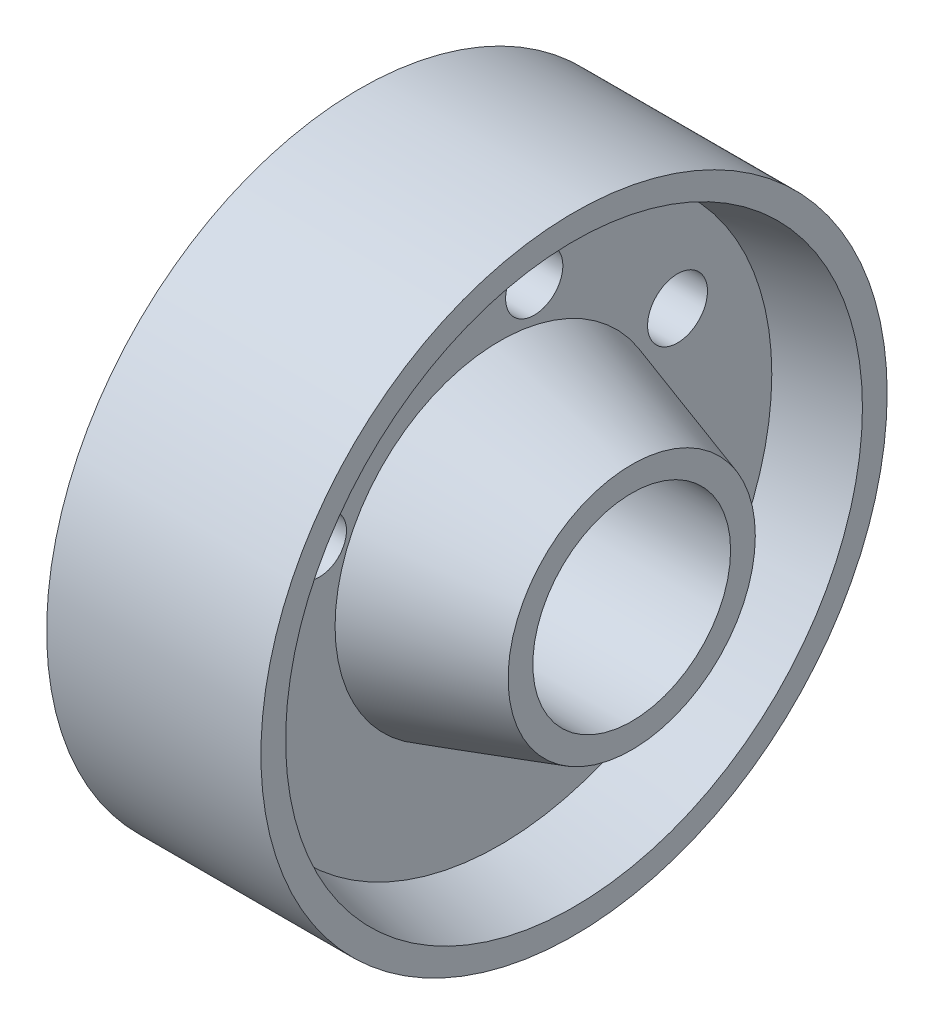
ISO-10303-21;
HEADER;
FILE_DESCRIPTION(('STEP AP214'),'2;1');
FILE_NAME('part.step','',(''),(''),'','','');
FILE_SCHEMA(('AUTOMOTIVE_DESIGN { 1 0 10303 214 1 1 1 1 }'));
ENDSEC;
DATA;
#1=APPLICATION_CONTEXT('core data for automotive mechanical design processes');
#2=APPLICATION_PROTOCOL_DEFINITION('international standard','automotive_design',2000,#1);
#3=PRODUCT_CONTEXT('',#1,'mechanical');
#4=PRODUCT('Part','Part','',(#3));
#5=PRODUCT_RELATED_PRODUCT_CATEGORY('part','',(#4));
#6=PRODUCT_DEFINITION_FORMATION('','',#4);
#7=PRODUCT_DEFINITION_CONTEXT('part definition',#1,'design');
#8=PRODUCT_DEFINITION('design','',#6,#7);
#9=PRODUCT_DEFINITION_SHAPE('','',#8);
#10=(LENGTH_UNIT() NAMED_UNIT(*) SI_UNIT(.MILLI.,.METRE.));
#11=(NAMED_UNIT(*) PLANE_ANGLE_UNIT() SI_UNIT($,.RADIAN.));
#12=(NAMED_UNIT(*) SI_UNIT($,.STERADIAN.) SOLID_ANGLE_UNIT());
#13=UNCERTAINTY_MEASURE_WITH_UNIT(LENGTH_MEASURE(1.E-05),#10,'distance_accuracy_value','');
#14=(GEOMETRIC_REPRESENTATION_CONTEXT(3) GLOBAL_UNCERTAINTY_ASSIGNED_CONTEXT((#13)) GLOBAL_UNIT_ASSIGNED_CONTEXT((#10,
#11,#12)) REPRESENTATION_CONTEXT('',''));
#15=CARTESIAN_POINT('',(0.,0.,0.));
#16=DIRECTION('',(0.,0.,1.));
#17=DIRECTION('',(1.,0.,0.));
#18=AXIS2_PLACEMENT_3D('',#15,#16,#17);
#19=CARTESIAN_POINT('',(29.5364069872464,0.,0.));
#20=DIRECTION('',(1.,0.,0.));
#21=DIRECTION('',(0.,0.,-1.));
#22=AXIS2_PLACEMENT_3D('',#19,#20,#21);
#23=CYLINDRICAL_SURFACE('',#22,12.);
#24=CARTESIAN_POINT('',(20.,0.,0.));
#25=DIRECTION('',(1.,0.,0.));
#26=DIRECTION('',(0.,0.,-1.));
#27=AXIS2_PLACEMENT_3D('',#24,#25,#26);
#28=CIRCLE('',#27,12.);
#29=CARTESIAN_POINT('',(20.,0.,-12.));
#30=VERTEX_POINT('',#29);
#31=EDGE_CURVE('E10',#30,#30,#28,.T.);
#32=ORIENTED_EDGE('',*,*,#31,.T.);
#33=EDGE_LOOP('',(#32));
#34=FACE_BOUND('',#33,.T.);
#35=CARTESIAN_POINT('',(-20.,0.,0.));
#36=DIRECTION('',(1.,0.,0.));
#37=DIRECTION('',(0.,0.,-1.));
#38=AXIS2_PLACEMENT_3D('',#35,#36,#37);
#39=CIRCLE('',#38,12.);
#40=CARTESIAN_POINT('',(-20.,0.,-12.));
#41=VERTEX_POINT('',#40);
#42=EDGE_CURVE('E71',#41,#41,#39,.T.);
#43=ORIENTED_EDGE('',*,*,#42,.F.);
#44=EDGE_LOOP('',(#43));
#45=FACE_BOUND('',#44,.T.);
#46=ADVANCED_FACE('F37',(#34,#45),#23,.F.);
#47=CARTESIAN_POINT('',(20.,12.,0.));
#48=DIRECTION('',(1.,0.,0.));
#49=DIRECTION('',(0.,0.,-1.));
#50=AXIS2_PLACEMENT_3D('',#47,#48,#49);
#51=PLANE('',#50);
#52=CARTESIAN_POINT('',(20.,0.,0.));
#53=DIRECTION('',(1.,0.,0.));
#54=DIRECTION('',(0.,0.,-1.));
#55=AXIS2_PLACEMENT_3D('',#52,#53,#54);
#56=CIRCLE('',#55,15.);
#57=CARTESIAN_POINT('',(20.,0.,-15.));
#58=VERTEX_POINT('',#57);
#59=EDGE_CURVE('E44',#58,#58,#56,.T.);
#60=ORIENTED_EDGE('',*,*,#59,.T.);
#61=EDGE_LOOP('',(#60));
#62=FACE_BOUND('',#61,.T.);
#63=ORIENTED_EDGE('',*,*,#31,.F.);
#64=EDGE_LOOP('',(#63));
#65=FACE_BOUND('',#64,.T.);
#66=ADVANCED_FACE('F118',(#62,#65),#51,.T.);
#67=CARTESIAN_POINT('',(20.,0.,0.));
#68=DIRECTION('',(-1.,0.,0.));
#69=DIRECTION('',(0.,0.,1.));
#70=AXIS2_PLACEMENT_3D('',#67,#68,#69);
#71=CONICAL_SURFACE('',#70,15.,0.302884868374971);
#72=CARTESIAN_POINT('',(4.,0.,0.));
#73=DIRECTION('',(1.,0.,0.));
#74=DIRECTION('',(0.,0.,-1.));
#75=AXIS2_PLACEMENT_3D('',#72,#73,#74);
#76=CIRCLE('',#75,20.);
#77=CARTESIAN_POINT('',(4.,0.,-20.));
#78=VERTEX_POINT('',#77);
#79=EDGE_CURVE('E49',#78,#78,#76,.T.);
#80=ORIENTED_EDGE('',*,*,#79,.T.);
#81=EDGE_LOOP('',(#80));
#82=FACE_BOUND('',#81,.T.);
#83=ORIENTED_EDGE('',*,*,#59,.F.);
#84=EDGE_LOOP('',(#83));
#85=FACE_BOUND('',#84,.T.);
#86=ADVANCED_FACE('F101',(#82,#85),#71,.T.);
#87=CARTESIAN_POINT('',(4.,20.,0.));
#88=DIRECTION('',(1.,0.,0.));
#89=DIRECTION('',(0.,0.,-1.));
#90=AXIS2_PLACEMENT_3D('',#87,#88,#89);
#91=PLANE('',#90);
#92=CARTESIAN_POINT('',(4.,9.38157811057917,21.8680251819841));
#93=DIRECTION('',(1.,0.,0.));
#94=DIRECTION('',(0.,0.,-1.));
#95=AXIS2_PLACEMENT_3D('',#92,#93,#94);
#96=CIRCLE('',#95,3.25324235110329);
#97=CARTESIAN_POINT('',(4.,9.38157811057917,18.6147828308808));
#98=VERTEX_POINT('',#97);
#99=EDGE_CURVE('E68',#98,#98,#96,.T.);
#100=ORIENTED_EDGE('',*,*,#99,.F.);
#101=EDGE_LOOP('',(#100));
#102=FACE_BOUND('',#101,.T.);
#103=CARTESIAN_POINT('',(4.,24.0897211875402,-4.16925207496423));
#104=DIRECTION('',(1.,0.,0.));
#105=DIRECTION('',(0.,0.,-1.));
#106=AXIS2_PLACEMENT_3D('',#103,#104,#105);
#107=CIRCLE('',#106,3.47588009217223);
#108=CARTESIAN_POINT('',(4.,24.0897211875402,-7.64513216713646));
#109=VERTEX_POINT('',#108);
#110=EDGE_CURVE('E58',#109,#109,#107,.T.);
#111=ORIENTED_EDGE('',*,*,#110,.F.);
#112=EDGE_LOOP('',(#111));
#113=FACE_BOUND('',#112,.T.);
#114=CARTESIAN_POINT('',(4.,12.6348204616825,-21.5584637924442));
#115=DIRECTION('',(1.,0.,0.));
#116=DIRECTION('',(0.,0.,-1.));
#117=AXIS2_PLACEMENT_3D('',#114,#115,#116);
#118=CIRCLE('',#117,3.63393703644211);
#119=CARTESIAN_POINT('',(4.,12.6348204616825,-25.1924008288863));
#120=VERTEX_POINT('',#119);
#121=EDGE_CURVE('E55',#120,#120,#118,.T.);
#122=ORIENTED_EDGE('',*,*,#121,.F.);
#123=EDGE_LOOP('',(#122));
#124=FACE_BOUND('',#123,.T.);
#125=CARTESIAN_POINT('',(4.,0.,0.));
#126=DIRECTION('',(1.,0.,0.));
#127=DIRECTION('',(0.,0.,-1.));
#128=AXIS2_PLACEMENT_3D('',#125,#126,#127);
#129=CIRCLE('',#128,33.);
#130=CARTESIAN_POINT('',(4.,0.,-33.));
#131=VERTEX_POINT('',#130);
#132=EDGE_CURVE('E96',#131,#131,#129,.T.);
#133=ORIENTED_EDGE('',*,*,#132,.T.);
#134=EDGE_LOOP('',(#133));
#135=FACE_BOUND('',#134,.T.);
#136=ORIENTED_EDGE('',*,*,#79,.F.);
#137=EDGE_LOOP('',(#136));
#138=FACE_BOUND('',#137,.T.);
#139=ADVANCED_FACE('F104',(#102,#113,#124,#135,#138),#91,.T.);
#140=CARTESIAN_POINT('',(4.,0.,0.));
#141=DIRECTION('',(1.,0.,0.));
#142=DIRECTION('',(0.,0.,-1.));
#143=AXIS2_PLACEMENT_3D('',#140,#141,#142);
#144=CONICAL_SURFACE('',#143,33.,0.218668945873942);
#145=CARTESIAN_POINT('',(13.,0.,0.));
#146=DIRECTION('',(1.,0.,0.));
#147=DIRECTION('',(0.,0.,-1.));
#148=AXIS2_PLACEMENT_3D('',#145,#146,#147);
#149=CIRCLE('',#148,35.);
#150=CARTESIAN_POINT('',(13.,0.,-35.));
#151=VERTEX_POINT('',#150);
#152=EDGE_CURVE('E93',#151,#151,#149,.T.);
#153=ORIENTED_EDGE('',*,*,#152,.T.);
#154=EDGE_LOOP('',(#153));
#155=FACE_BOUND('',#154,.T.);
#156=ORIENTED_EDGE('',*,*,#132,.F.);
#157=EDGE_LOOP('',(#156));
#158=FACE_BOUND('',#157,.T.);
#159=ADVANCED_FACE('F106',(#155,#158),#144,.F.);
#160=CARTESIAN_POINT('',(13.,35.,0.));
#161=DIRECTION('',(1.,0.,0.));
#162=DIRECTION('',(0.,0.,-1.));
#163=AXIS2_PLACEMENT_3D('',#160,#161,#162);
#164=PLANE('',#163);
#165=CARTESIAN_POINT('',(13.,0.,0.));
#166=DIRECTION('',(1.,0.,0.));
#167=DIRECTION('',(0.,0.,-1.));
#168=AXIS2_PLACEMENT_3D('',#165,#166,#167);
#169=CIRCLE('',#168,38.);
#170=CARTESIAN_POINT('',(13.,0.,-38.));
#171=VERTEX_POINT('',#170);
#172=EDGE_CURVE('E90',#171,#171,#169,.T.);
#173=ORIENTED_EDGE('',*,*,#172,.T.);
#174=EDGE_LOOP('',(#173));
#175=FACE_BOUND('',#174,.T.);
#176=ORIENTED_EDGE('',*,*,#152,.F.);
#177=EDGE_LOOP('',(#176));
#178=FACE_BOUND('',#177,.T.);
#179=ADVANCED_FACE('F114',(#175,#178),#164,.T.);
#180=CARTESIAN_POINT('',(29.5364069872464,0.,0.));
#181=DIRECTION('',(1.,0.,0.));
#182=DIRECTION('',(0.,0.,-1.));
#183=AXIS2_PLACEMENT_3D('',#180,#181,#182);
#184=CYLINDRICAL_SURFACE('',#183,38.);
#185=CARTESIAN_POINT('',(-13.,0.,0.));
#186=DIRECTION('',(1.,0.,0.));
#187=DIRECTION('',(0.,0.,-1.));
#188=AXIS2_PLACEMENT_3D('',#185,#186,#187);
#189=CIRCLE('',#188,38.);
#190=CARTESIAN_POINT('',(-13.,0.,-38.));
#191=VERTEX_POINT('',#190);
#192=EDGE_CURVE('E87',#191,#191,#189,.T.);
#193=ORIENTED_EDGE('',*,*,#192,.T.);
#194=EDGE_LOOP('',(#193));
#195=FACE_BOUND('',#194,.T.);
#196=ORIENTED_EDGE('',*,*,#172,.F.);
#197=EDGE_LOOP('',(#196));
#198=FACE_BOUND('',#197,.T.);
#199=ADVANCED_FACE('F158',(#195,#198),#184,.T.);
#200=CARTESIAN_POINT('',(-13.,35.,0.));
#201=DIRECTION('',(-1.,0.,0.));
#202=DIRECTION('',(0.,0.,1.));
#203=AXIS2_PLACEMENT_3D('',#200,#201,#202);
#204=PLANE('',#203);
#205=CARTESIAN_POINT('',(-13.,0.,0.));
#206=DIRECTION('',(1.,0.,0.));
#207=DIRECTION('',(0.,0.,-1.));
#208=AXIS2_PLACEMENT_3D('',#205,#206,#207);
#209=CIRCLE('',#208,35.);
#210=CARTESIAN_POINT('',(-13.,0.,-35.));
#211=VERTEX_POINT('',#210);
#212=EDGE_CURVE('E84',#211,#211,#209,.T.);
#213=ORIENTED_EDGE('',*,*,#212,.T.);
#214=EDGE_LOOP('',(#213));
#215=FACE_BOUND('',#214,.T.);
#216=ORIENTED_EDGE('',*,*,#192,.F.);
#217=EDGE_LOOP('',(#216));
#218=FACE_BOUND('',#217,.T.);
#219=ADVANCED_FACE('F152',(#215,#218),#204,.T.);
#220=CARTESIAN_POINT('',(-13.,0.,0.));
#221=DIRECTION('',(-1.,0.,0.));
#222=DIRECTION('',(0.,0.,1.));
#223=AXIS2_PLACEMENT_3D('',#220,#221,#222);
#224=CONICAL_SURFACE('',#223,35.,0.218668945873942);
#225=CARTESIAN_POINT('',(-4.,0.,0.));
#226=DIRECTION('',(1.,0.,0.));
#227=DIRECTION('',(0.,0.,-1.));
#228=AXIS2_PLACEMENT_3D('',#225,#226,#227);
#229=CIRCLE('',#228,33.);
#230=CARTESIAN_POINT('',(-4.,0.,-33.));
#231=VERTEX_POINT('',#230);
#232=EDGE_CURVE('E81',#231,#231,#229,.T.);
#233=ORIENTED_EDGE('',*,*,#232,.T.);
#234=EDGE_LOOP('',(#233));
#235=FACE_BOUND('',#234,.T.);
#236=ORIENTED_EDGE('',*,*,#212,.F.);
#237=EDGE_LOOP('',(#236));
#238=FACE_BOUND('',#237,.T.);
#239=ADVANCED_FACE('F145',(#235,#238),#224,.F.);
#240=CARTESIAN_POINT('',(-4.,20.,0.));
#241=DIRECTION('',(-1.,0.,0.));
#242=DIRECTION('',(0.,0.,1.));
#243=AXIS2_PLACEMENT_3D('',#240,#241,#242);
#244=PLANE('',#243);
#245=CARTESIAN_POINT('',(-4.,9.38157811057917,21.8680251819841));
#246=DIRECTION('',(-1.,0.,0.));
#247=DIRECTION('',(0.,0.,1.));
#248=AXIS2_PLACEMENT_3D('',#245,#246,#247);
#249=CIRCLE('',#248,3.25324235110329);
#250=CARTESIAN_POINT('',(-4.,9.38157811057917,25.1212675330874));
#251=VERTEX_POINT('',#250);
#252=EDGE_CURVE('E40',#251,#251,#249,.T.);
#253=ORIENTED_EDGE('',*,*,#252,.F.);
#254=EDGE_LOOP('',(#253));
#255=FACE_BOUND('',#254,.T.);
#256=CARTESIAN_POINT('',(-4.,24.0897211875402,-4.16925207496423));
#257=DIRECTION('',(-1.,0.,0.));
#258=DIRECTION('',(0.,0.,1.));
#259=AXIS2_PLACEMENT_3D('',#256,#257,#258);
#260=CIRCLE('',#259,3.47588009217223);
#261=CARTESIAN_POINT('',(-4.,24.0897211875402,-0.693371982792));
#262=VERTEX_POINT('',#261);
#263=EDGE_CURVE('E56',#262,#262,#260,.T.);
#264=ORIENTED_EDGE('',*,*,#263,.F.);
#265=EDGE_LOOP('',(#264));
#266=FACE_BOUND('',#265,.T.);
#267=CARTESIAN_POINT('',(-4.,12.6348204616825,-21.5584637924442));
#268=DIRECTION('',(-1.,0.,0.));
#269=DIRECTION('',(0.,0.,1.));
#270=AXIS2_PLACEMENT_3D('',#267,#268,#269);
#271=CIRCLE('',#270,3.63393703644211);
#272=CARTESIAN_POINT('',(-4.,12.6348204616825,-17.9245267560021));
#273=VERTEX_POINT('',#272);
#274=EDGE_CURVE('E53',#273,#273,#271,.T.);
#275=ORIENTED_EDGE('',*,*,#274,.F.);
#276=EDGE_LOOP('',(#275));
#277=FACE_BOUND('',#276,.T.);
#278=CARTESIAN_POINT('',(-4.,0.,0.));
#279=DIRECTION('',(1.,0.,0.));
#280=DIRECTION('',(0.,0.,-1.));
#281=AXIS2_PLACEMENT_3D('',#278,#279,#280);
#282=CIRCLE('',#281,20.);
#283=CARTESIAN_POINT('',(-4.,0.,-20.));
#284=VERTEX_POINT('',#283);
#285=EDGE_CURVE('E77',#284,#284,#282,.T.);
#286=ORIENTED_EDGE('',*,*,#285,.T.);
#287=EDGE_LOOP('',(#286));
#288=FACE_BOUND('',#287,.T.);
#289=ORIENTED_EDGE('',*,*,#232,.F.);
#290=EDGE_LOOP('',(#289));
#291=FACE_BOUND('',#290,.T.);
#292=ADVANCED_FACE('F140',(#255,#266,#277,#288,#291),#244,.T.);
#293=CARTESIAN_POINT('',(-4.,0.,0.));
#294=DIRECTION('',(1.,0.,0.));
#295=DIRECTION('',(0.,0.,-1.));
#296=AXIS2_PLACEMENT_3D('',#293,#294,#295);
#297=CONICAL_SURFACE('',#296,20.,0.302884868374971);
#298=CARTESIAN_POINT('',(-20.,0.,0.));
#299=DIRECTION('',(1.,0.,0.));
#300=DIRECTION('',(0.,0.,-1.));
#301=AXIS2_PLACEMENT_3D('',#298,#299,#300);
#302=CIRCLE('',#301,15.);
#303=CARTESIAN_POINT('',(-20.,0.,-15.));
#304=VERTEX_POINT('',#303);
#305=EDGE_CURVE('E74',#304,#304,#302,.T.);
#306=ORIENTED_EDGE('',*,*,#305,.T.);
#307=EDGE_LOOP('',(#306));
#308=FACE_BOUND('',#307,.T.);
#309=ORIENTED_EDGE('',*,*,#285,.F.);
#310=EDGE_LOOP('',(#309));
#311=FACE_BOUND('',#310,.T.);
#312=ADVANCED_FACE('F134',(#308,#311),#297,.T.);
#313=CARTESIAN_POINT('',(-20.,12.,0.));
#314=DIRECTION('',(-1.,0.,0.));
#315=DIRECTION('',(0.,0.,1.));
#316=AXIS2_PLACEMENT_3D('',#313,#314,#315);
#317=PLANE('',#316);
#318=ORIENTED_EDGE('',*,*,#42,.T.);
#319=EDGE_LOOP('',(#318));
#320=FACE_BOUND('',#319,.T.);
#321=ORIENTED_EDGE('',*,*,#305,.F.);
#322=EDGE_LOOP('',(#321));
#323=FACE_BOUND('',#322,.T.);
#324=ADVANCED_FACE('F130',(#320,#323),#317,.T.);
#325=CARTESIAN_POINT('',(-20.,12.6348204616825,-21.5584637924442));
#326=DIRECTION('',(1.,0.,0.));
#327=DIRECTION('',(0.,0.,-1.));
#328=AXIS2_PLACEMENT_3D('',#325,#326,#327);
#329=CYLINDRICAL_SURFACE('',#328,3.63393703644211);
#330=ORIENTED_EDGE('',*,*,#121,.T.);
#331=EDGE_LOOP('',(#330));
#332=FACE_BOUND('',#331,.T.);
#333=ORIENTED_EDGE('',*,*,#274,.T.);
#334=EDGE_LOOP('',(#333));
#335=FACE_BOUND('',#334,.T.);
#336=ADVANCED_FACE('F133',(#332,#335),#329,.F.);
#337=CARTESIAN_POINT('',(-20.,24.0897211875402,-4.16925207496423));
#338=DIRECTION('',(1.,0.,0.));
#339=DIRECTION('',(0.,0.,-1.));
#340=AXIS2_PLACEMENT_3D('',#337,#338,#339);
#341=CYLINDRICAL_SURFACE('',#340,3.47588009217223);
#342=ORIENTED_EDGE('',*,*,#110,.T.);
#343=EDGE_LOOP('',(#342));
#344=FACE_BOUND('',#343,.T.);
#345=ORIENTED_EDGE('',*,*,#263,.T.);
#346=EDGE_LOOP('',(#345));
#347=FACE_BOUND('',#346,.T.);
#348=ADVANCED_FACE('F179',(#344,#347),#341,.F.);
#349=CARTESIAN_POINT('',(-20.,9.38157811057917,21.8680251819841));
#350=DIRECTION('',(1.,0.,0.));
#351=DIRECTION('',(0.,0.,-1.));
#352=AXIS2_PLACEMENT_3D('',#349,#350,#351);
#353=CYLINDRICAL_SURFACE('',#352,3.25324235110329);
#354=ORIENTED_EDGE('',*,*,#99,.T.);
#355=EDGE_LOOP('',(#354));
#356=FACE_BOUND('',#355,.T.);
#357=ORIENTED_EDGE('',*,*,#252,.T.);
#358=EDGE_LOOP('',(#357));
#359=FACE_BOUND('',#358,.T.);
#360=ADVANCED_FACE('F182',(#356,#359),#353,.F.);
#361=CLOSED_SHELL('',(#46,#66,#86,#139,#159,#179,#199,#219,#239,#292,#312,#324,#336,#348,#360));
#362=MANIFOLD_SOLID_BREP('B2',#361);
#363=ADVANCED_BREP_SHAPE_REPRESENTATION('',(#18,#362),#14);
#364=SHAPE_DEFINITION_REPRESENTATION(#9,#363);
ENDSEC;
END-ISO-10303-21;
